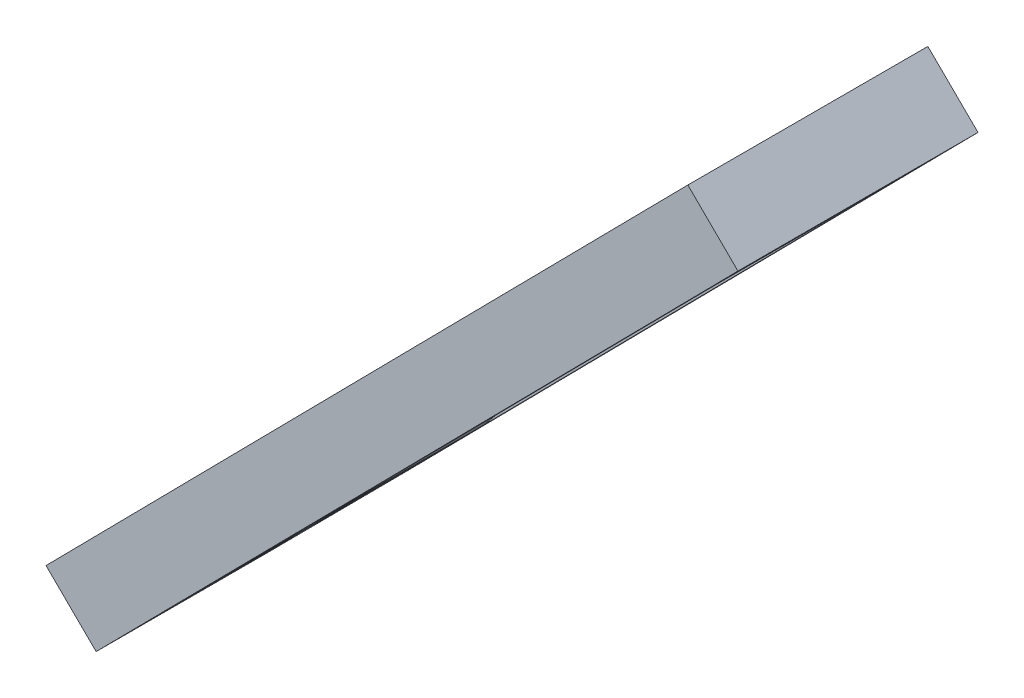
ISO-10303-21;
HEADER;
FILE_DESCRIPTION(('STEP AP214'),'2;1');
FILE_NAME('part.step','',(''),(''),'','','');
FILE_SCHEMA(('AUTOMOTIVE_DESIGN { 1 0 10303 214 1 1 1 1 }'));
ENDSEC;
DATA;
#1=APPLICATION_CONTEXT('core data for automotive mechanical design processes');
#2=APPLICATION_PROTOCOL_DEFINITION('international standard','automotive_design',2000,#1);
#3=PRODUCT_CONTEXT('',#1,'mechanical');
#4=PRODUCT('Part','Part','',(#3));
#5=PRODUCT_RELATED_PRODUCT_CATEGORY('part','',(#4));
#6=PRODUCT_DEFINITION_FORMATION('','',#4);
#7=PRODUCT_DEFINITION_CONTEXT('part definition',#1,'design');
#8=PRODUCT_DEFINITION('design','',#6,#7);
#9=PRODUCT_DEFINITION_SHAPE('','',#8);
#10=(LENGTH_UNIT() NAMED_UNIT(*) SI_UNIT(.MILLI.,.METRE.));
#11=(NAMED_UNIT(*) PLANE_ANGLE_UNIT() SI_UNIT($,.RADIAN.));
#12=(NAMED_UNIT(*) SI_UNIT($,.STERADIAN.) SOLID_ANGLE_UNIT());
#13=UNCERTAINTY_MEASURE_WITH_UNIT(LENGTH_MEASURE(1.E-05),#10,'distance_accuracy_value','');
#14=(GEOMETRIC_REPRESENTATION_CONTEXT(3) GLOBAL_UNCERTAINTY_ASSIGNED_CONTEXT((#13)) GLOBAL_UNIT_ASSIGNED_CONTEXT((#10,
#11,#12)) REPRESENTATION_CONTEXT('',''));
#15=CARTESIAN_POINT('',(0.,0.,0.));
#16=DIRECTION('',(0.,0.,1.));
#17=DIRECTION('',(1.,0.,0.));
#18=AXIS2_PLACEMENT_3D('',#15,#16,#17);
#19=CARTESIAN_POINT('',(-24.6035409540057,49.3721859191948,92.15));
#20=DIRECTION('',(0.702343730166743,0.711837962387133,0.));
#21=DIRECTION('',(0.711837962387133,-0.702343730166743,0.));
#22=AXIS2_PLACEMENT_3D('',#19,#20,#21);
#23=PLANE('',#22);
#24=DIRECTION('',(0.711837962387133,-0.702343730166743,0.));
#25=VECTOR('',#24,1.);
#26=CARTESIAN_POINT('',(-25.8136654900639,50.5661702604782,95.45));
#27=LINE('',#26,#25);
#28=CARTESIAN_POINT('',(-25.8136654900639,50.5661702604782,95.45));
#29=VERTEX_POINT('',#28);
#30=CARTESIAN_POINT('',(-24.6035409540057,49.3721859191948,95.45));
#31=VERTEX_POINT('',#30);
#32=EDGE_CURVE('E223',#29,#31,#27,.T.);
#33=ORIENTED_EDGE('',*,*,#32,.T.);
#34=DIRECTION('',(0.,0.,1.));
#35=VECTOR('',#34,1.);
#36=CARTESIAN_POINT('',(-24.6035409540057,49.3721859191948,92.15));
#37=LINE('',#36,#35);
#38=CARTESIAN_POINT('',(-24.6035409540057,49.3721859191948,97.65));
#39=VERTEX_POINT('',#38);
#40=EDGE_CURVE('E240',#31,#39,#37,.T.);
#41=ORIENTED_EDGE('',*,*,#40,.T.);
#42=DIRECTION('',(0.711837962387133,-0.702343730166743,0.));
#43=VECTOR('',#42,1.);
#44=CARTESIAN_POINT('',(-24.6035409540057,49.3721859191948,97.65));
#45=LINE('',#44,#43);
#46=CARTESIAN_POINT('',(-25.8136654900639,50.5661702604782,97.65));
#47=VERTEX_POINT('',#46);
#48=EDGE_CURVE('E377',#47,#39,#45,.T.);
#49=ORIENTED_EDGE('',*,*,#48,.F.);
#50=DIRECTION('',(0.,0.,1.));
#51=VECTOR('',#50,1.);
#52=CARTESIAN_POINT('',(-25.8136654900639,50.5661702604782,92.15));
#53=LINE('',#52,#51);
#54=EDGE_CURVE('E252',#29,#47,#53,.T.);
#55=ORIENTED_EDGE('',*,*,#54,.F.);
#56=EDGE_LOOP('',(#33,#41,#49,#55));
#57=FACE_BOUND('',#56,.T.);
#58=ADVANCED_FACE('F36',(#57),#23,.F.);
#59=CARTESIAN_POINT('',(-25.8136654900639,50.5661702604782,92.15));
#60=DIRECTION('',(-0.774517720209106,0.632552212139116,0.));
#61=DIRECTION('',(0.632552212139116,0.774517720209106,0.));
#62=AXIS2_PLACEMENT_3D('',#59,#60,#61);
#63=PLANE('',#62);
#64=DIRECTION('',(0.632552212139115,0.774517720209107,0.));
#65=VECTOR('',#64,1.);
#66=CARTESIAN_POINT('',(-28.4507583892312,47.33722703485,95.45));
#67=LINE('',#66,#65);
#68=CARTESIAN_POINT('',(-28.4507583892312,47.33722703485,95.45));
#69=VERTEX_POINT('',#68);
#70=EDGE_CURVE('E224',#69,#29,#67,.T.);
#71=ORIENTED_EDGE('',*,*,#70,.T.);
#72=ORIENTED_EDGE('',*,*,#54,.T.);
#73=DIRECTION('',(0.632552212139116,0.774517720209106,0.));
#74=VECTOR('',#73,1.);
#75=CARTESIAN_POINT('',(-25.8136654900639,50.5661702604782,97.65));
#76=LINE('',#75,#74);
#77=CARTESIAN_POINT('',(-37.2897005260863,36.5145357510014,97.65));
#78=VERTEX_POINT('',#77);
#79=EDGE_CURVE('E384',#78,#47,#76,.T.);
#80=ORIENTED_EDGE('',*,*,#79,.F.);
#81=DIRECTION('',(0.,0.,1.));
#82=VECTOR('',#81,1.);
#83=CARTESIAN_POINT('',(-37.2897005260863,36.5145357510014,92.15));
#84=LINE('',#83,#82);
#85=CARTESIAN_POINT('',(-37.2897005260863,36.5145357510014,92.15));
#86=VERTEX_POINT('',#85);
#87=EDGE_CURVE('E382',#86,#78,#84,.T.);
#88=ORIENTED_EDGE('',*,*,#87,.F.);
#89=DIRECTION('',(0.632552212139116,0.774517720209106,0.));
#90=VECTOR('',#89,1.);
#91=CARTESIAN_POINT('',(-25.8136654900639,50.5661702604782,92.15));
#92=LINE('',#91,#90);
#93=CARTESIAN_POINT('',(-25.8136654900639,50.5661702604782,92.15));
#94=VERTEX_POINT('',#93);
#95=EDGE_CURVE('E376',#86,#94,#92,.T.);
#96=ORIENTED_EDGE('',*,*,#95,.T.);
#97=CARTESIAN_POINT('',(-25.8136654900639,50.5661702604782,94.45));
#98=VERTEX_POINT('',#97);
#99=EDGE_CURVE('E248',#94,#98,#53,.T.);
#100=ORIENTED_EDGE('',*,*,#99,.T.);
#101=DIRECTION('',(0.632552212139115,0.774517720209107,0.));
#102=VECTOR('',#101,1.);
#103=CARTESIAN_POINT('',(-28.4507583892312,47.33722703485,94.45));
#104=LINE('',#103,#102);
#105=CARTESIAN_POINT('',(-28.4507583892312,47.33722703485,94.45));
#106=VERTEX_POINT('',#105);
#107=EDGE_CURVE('E253',#106,#98,#104,.T.);
#108=ORIENTED_EDGE('',*,*,#107,.F.);
#109=DIRECTION('',(0.,0.,-1.));
#110=VECTOR('',#109,1.);
#111=CARTESIAN_POINT('',(-28.4507583892312,47.33722703485,95.45));
#112=LINE('',#111,#110);
#113=EDGE_CURVE('E237',#69,#106,#112,.T.);
#114=ORIENTED_EDGE('',*,*,#113,.F.);
#115=EDGE_LOOP('',(#71,#72,#80,#88,#96,#100,#108,#114));
#116=FACE_BOUND('',#115,.T.);
#117=ADVANCED_FACE('F456',(#116),#63,.F.);
#118=CARTESIAN_POINT('',(-37.1508087961253,36.6553050094161,0.));
#119=DIRECTION('',(0.71183796238714,-0.702343730166737,0.));
#120=DIRECTION('',(-0.702343730166737,-0.71183796238714,0.));
#121=AXIS2_PLACEMENT_3D('',#118,#119,#120);
#122=PLANE('',#121);
#123=CARTESIAN_POINT('',(-41.9655545474581,31.7754738700007,93.0729681256926));
#124=DIRECTION('',(-0.71183796238714,0.702343730166736,0.));
#125=DIRECTION('',(-0.702343730166737,-0.71183796238714,0.));
#126=AXIS2_PLACEMENT_3D('',#123,#124,#125);
#127=CIRCLE('',#126,0.321376144753736);
#128=CARTESIAN_POINT('',(-41.8376796329103,31.9050773884808,92.8081407089779));
#129=VERTEX_POINT('',#128);
#130=CARTESIAN_POINT('',(-42.0934294620058,31.6458703515205,93.3377955424072));
#131=VERTEX_POINT('',#130);
#132=EDGE_CURVE('E270',#129,#131,#127,.T.);
#133=ORIENTED_EDGE('',*,*,#132,.T.);
#134=DIRECTION('',(0.578760678855961,0.58658432424366,0.566528822887059));
#135=VECTOR('',#134,1.);
#136=CARTESIAN_POINT('',(-42.0934294620058,31.6458703515205,93.3377955424072));
#137=LINE('',#136,#135);
#138=CARTESIAN_POINT('',(-41.0297885386712,32.7238894966453,94.3789568760734));
#139=VERTEX_POINT('',#138);
#140=EDGE_CURVE('E273',#131,#139,#137,.T.);
#141=ORIENTED_EDGE('',*,*,#140,.T.);
#142=CARTESIAN_POINT('',(-40.9019136241235,32.8534930151254,94.1141294593588));
#143=DIRECTION('',(-0.71183796238714,0.702343730166736,0.));
#144=DIRECTION('',(-0.702343730166737,-0.71183796238714,0.));
#145=AXIS2_PLACEMENT_3D('',#142,#143,#144);
#146=CIRCLE('',#145,0.321376144753728);
#147=CARTESIAN_POINT('',(-40.7740387095758,32.9830965336056,93.8493020426442));
#148=VERTEX_POINT('',#147);
#149=EDGE_CURVE('E277',#139,#148,#146,.T.);
#150=ORIENTED_EDGE('',*,*,#149,.T.);
#151=DIRECTION('',(-0.578760678855957,-0.586584324243656,-0.566528822887067));
#152=VECTOR('',#151,1.);
#153=CARTESIAN_POINT('',(-41.8376796329103,31.9050773884808,92.8081407089779));
#154=LINE('',#153,#152);
#155=EDGE_CURVE('E264',#148,#129,#154,.T.);
#156=ORIENTED_EDGE('',*,*,#155,.T.);
#157=EDGE_LOOP('',(#133,#141,#150,#156));
#158=FACE_BOUND('',#157,.T.);
#159=CARTESIAN_POINT('',(-40.9019136241235,32.8534930151254,96.328756093485));
#160=DIRECTION('',(-0.71183796238714,0.702343730166736,0.));
#161=DIRECTION('',(-0.702343730166737,-0.71183796238714,0.));
#162=AXIS2_PLACEMENT_3D('',#159,#160,#161);
#163=CIRCLE('',#162,0.305790106119295);
#164=CARTESIAN_POINT('',(-40.7664813949906,32.9907560074278,96.5660840759412));
#165=VERTEX_POINT('',#164);
#166=CARTESIAN_POINT('',(-41.0373458532563,32.7162300228231,96.0914281110288));
#167=VERTEX_POINT('',#166);
#168=EDGE_CURVE('E300',#165,#167,#163,.T.);
#169=ORIENTED_EDGE('',*,*,#168,.T.);
#170=DIRECTION('',(-0.545098801876283,-0.552467408422892,0.630592625094469));
#171=VECTOR('',#170,1.);
#172=CARTESIAN_POINT('',(-41.0373458532564,32.716230022823,96.0914281110288));
#173=LINE('',#172,#171);
#174=CARTESIAN_POINT('',(-42.1009867765909,31.6382108776983,97.3218915053616));
#175=VERTEX_POINT('',#174);
#176=EDGE_CURVE('E303',#167,#175,#173,.T.);
#177=ORIENTED_EDGE('',*,*,#176,.T.);
#178=CARTESIAN_POINT('',(-41.9655545474581,31.7754738700007,97.5592194878178));
#179=DIRECTION('',(-0.71183796238714,0.702343730166736,0.));
#180=DIRECTION('',(-0.702343730166737,-0.71183796238714,0.));
#181=AXIS2_PLACEMENT_3D('',#178,#179,#180);
#182=CIRCLE('',#181,0.305790106119294);
#183=CARTESIAN_POINT('',(-41.8301223183252,31.9127368623031,97.7965474702741));
#184=VERTEX_POINT('',#183);
#185=EDGE_CURVE('E307',#175,#184,#182,.T.);
#186=ORIENTED_EDGE('',*,*,#185,.T.);
#187=DIRECTION('',(0.545098801876282,0.552467408422894,-0.630592625094468));
#188=VECTOR('',#187,1.);
#189=CARTESIAN_POINT('',(-40.7664813949906,32.9907560074278,96.5660840759412));
#190=LINE('',#189,#188);
#191=EDGE_CURVE('E293',#184,#165,#190,.T.);
#192=ORIENTED_EDGE('',*,*,#191,.T.);
#193=EDGE_LOOP('',(#169,#177,#186,#192));
#194=FACE_BOUND('',#193,.T.);
#195=CARTESIAN_POINT('',(-38.0875354506696,35.7059157510736,93.0729681256926));
#196=DIRECTION('',(-0.71183796238714,0.702343730166736,0.));
#197=DIRECTION('',(-0.702343730166737,-0.71183796238714,0.));
#198=AXIS2_PLACEMENT_3D('',#195,#196,#197);
#199=CIRCLE('',#198,0.332328622406024);
#200=CARTESIAN_POINT('',(-37.9403495043736,35.8550913464455,93.3308930221812));
#201=VERTEX_POINT('',#200);
#202=CARTESIAN_POINT('',(-38.2347213969655,35.5567401557017,92.8150432292039));
#203=VERTEX_POINT('',#202);
#204=EDGE_CURVE('E329',#201,#203,#199,.T.);
#205=ORIENTED_EDGE('',*,*,#204,.T.);
#206=DIRECTION('',(-0.545098801876284,-0.552467408422895,0.630592625094466));
#207=VECTOR('',#206,1.);
#208=CARTESIAN_POINT('',(-38.2347213969655,35.5567401557018,92.8150432292039));
#209=LINE('',#208,#207);
#210=CARTESIAN_POINT('',(-39.1347252551717,34.644570109827,93.8562045628701));
#211=VERTEX_POINT('',#210);
#212=EDGE_CURVE('E332',#203,#211,#209,.T.);
#213=ORIENTED_EDGE('',*,*,#212,.T.);
#214=CARTESIAN_POINT('',(-38.9875393088757,34.7937457051989,94.1141294593588));
#215=DIRECTION('',(-0.71183796238714,0.702343730166736,0.));
#216=DIRECTION('',(-0.702343730166737,-0.71183796238714,0.));
#217=AXIS2_PLACEMENT_3D('',#214,#215,#216);
#218=CIRCLE('',#217,0.332328622406024);
#219=CARTESIAN_POINT('',(-38.8403533625798,34.9429213005708,94.3720543558475));
#220=VERTEX_POINT('',#219);
#221=EDGE_CURVE('E336',#211,#220,#218,.T.);
#222=ORIENTED_EDGE('',*,*,#221,.T.);
#223=DIRECTION('',(0.545098801876284,0.552467408422895,-0.630592625094466));
#224=VECTOR('',#223,1.);
#225=CARTESIAN_POINT('',(-37.9403495043736,35.8550913464455,93.3308930221812));
#226=LINE('',#225,#224);
#227=EDGE_CURVE('E322',#220,#201,#226,.T.);
#228=ORIENTED_EDGE('',*,*,#227,.T.);
#229=EDGE_LOOP('',(#205,#213,#222,#228));
#230=FACE_BOUND('',#229,.T.);
#231=CARTESIAN_POINT('',(-38.9875393088757,34.7937457051989,95.9880443036195));
#232=DIRECTION('',(-0.71183796238714,0.702343730166736,0.));
#233=DIRECTION('',(-0.702343730166737,-0.71183796238714,0.));
#234=AXIS2_PLACEMENT_3D('',#231,#232,#233);
#235=CIRCLE('',#234,0.327637782178827);
#236=CARTESIAN_POINT('',(-38.8571729015282,34.9258743962999,95.7180570351524));
#237=VERTEX_POINT('',#236);
#238=CARTESIAN_POINT('',(-39.1179057162232,34.6616170140979,96.2580315720865));
#239=VERTEX_POINT('',#238);
#240=EDGE_CURVE('E236',#237,#239,#235,.T.);
#241=ORIENTED_EDGE('',*,*,#240,.T.);
#242=DIRECTION('',(0.578760678855961,0.586584324243655,0.566528822887064));
#243=VECTOR('',#242,1.);
#244=CARTESIAN_POINT('',(-39.1179057162232,34.6616170140979,96.2580315720865));
#245=LINE('',#244,#243);
#246=CARTESIAN_POINT('',(-38.217901858017,35.5737870599726,97.1390142390349));
#247=VERTEX_POINT('',#246);
#248=EDGE_CURVE('E360',#239,#247,#245,.T.);
#249=ORIENTED_EDGE('',*,*,#248,.T.);
#250=CARTESIAN_POINT('',(-38.0875354506696,35.7059157510736,96.8690269705678));
#251=DIRECTION('',(-0.71183796238714,0.702343730166736,0.));
#252=DIRECTION('',(-0.702343730166737,-0.71183796238714,0.));
#253=AXIS2_PLACEMENT_3D('',#250,#251,#252);
#254=CIRCLE('',#253,0.327637782178827);
#255=CARTESIAN_POINT('',(-37.9571690433221,35.8380444421747,96.5990397021008));
#256=VERTEX_POINT('',#255);
#257=EDGE_CURVE('E363',#247,#256,#254,.T.);
#258=ORIENTED_EDGE('',*,*,#257,.T.);
#259=DIRECTION('',(-0.578760678855961,-0.586584324243655,-0.566528822887064));
#260=VECTOR('',#259,1.);
#261=CARTESIAN_POINT('',(-38.8571729015282,34.9258743962999,95.7180570351524));
#262=LINE('',#261,#260);
#263=EDGE_CURVE('E351',#256,#237,#262,.T.);
#264=ORIENTED_EDGE('',*,*,#263,.T.);
#265=EDGE_LOOP('',(#241,#249,#258,#264));
#266=FACE_BOUND('',#265,.T.);
#267=DIRECTION('',(-0.58969934349156,-0.597670856964029,0.543179740989579));
#268=VECTOR('',#267,1.);
#269=CARTESIAN_POINT('',(-8.97574379923739,65.2112385161459,62.0086944342022));
#270=LINE('',#269,#268);
#271=CARTESIAN_POINT('',(-40.6128014135928,33.1465134238028,91.15));
#272=VERTEX_POINT('',#271);
#273=CARTESIAN_POINT('',(-42.9084503674201,30.8198320519043,93.2645521322101));
#274=VERTEX_POINT('',#273);
#275=EDGE_CURVE('E391',#272,#274,#270,.T.);
#276=ORIENTED_EDGE('',*,*,#275,.F.);
#277=DIRECTION('',(-0.702343730166737,-0.71183796238714,0.));
#278=VECTOR('',#277,1.);
#279=CARTESIAN_POINT('',(-37.1508087961253,36.6553050094161,91.15));
#280=LINE('',#279,#278);
#281=CARTESIAN_POINT('',(-22.8559679123544,51.1433825280069,91.15));
#282=VERTEX_POINT('',#281);
#283=EDGE_CURVE('E404',#282,#272,#280,.T.);
#284=ORIENTED_EDGE('',*,*,#283,.F.);
#285=DIRECTION('',(0.,0.,-1.));
#286=VECTOR('',#285,1.);
#287=CARTESIAN_POINT('',(-22.8559679123544,51.1433825280069,0.));
#288=LINE('',#287,#286);
#289=CARTESIAN_POINT('',(-22.8559679123544,51.1433825280069,98.65));
#290=VERTEX_POINT('',#289);
#291=EDGE_CURVE('E401',#290,#282,#288,.T.);
#292=ORIENTED_EDGE('',*,*,#291,.F.);
#293=DIRECTION('',(0.702343730166737,0.71183796238714,0.));
#294=VECTOR('',#293,1.);
#295=CARTESIAN_POINT('',(-37.1508087961253,36.6553050094161,98.65));
#296=LINE('',#295,#294);
#297=CARTESIAN_POINT('',(-42.9084503674201,30.8198320519043,98.65));
#298=VERTEX_POINT('',#297);
#299=EDGE_CURVE('E398',#298,#290,#296,.T.);
#300=ORIENTED_EDGE('',*,*,#299,.F.);
#301=DIRECTION('',(0.,0.,1.));
#302=VECTOR('',#301,1.);
#303=CARTESIAN_POINT('',(-42.9084503674201,30.8198320519043,0.));
#304=LINE('',#303,#302);
#305=EDGE_CURVE('E394',#274,#298,#304,.T.);
#306=ORIENTED_EDGE('',*,*,#305,.F.);
#307=EDGE_LOOP('',(#276,#284,#292,#300,#306));
#308=FACE_BOUND('',#307,.T.);
#309=ORIENTED_EDGE('',*,*,#87,.T.);
#310=DIRECTION('',(-0.702343730166737,-0.711837962387139,0.));
#311=VECTOR('',#310,1.);
#312=CARTESIAN_POINT('',(-24.6035409540057,49.3721859191948,97.65));
#313=LINE('',#312,#311);
#314=EDGE_CURVE('E243',#39,#78,#313,.T.);
#315=ORIENTED_EDGE('',*,*,#314,.F.);
#316=ORIENTED_EDGE('',*,*,#40,.F.);
#317=DIRECTION('',(0.,0.,-1.));
#318=VECTOR('',#317,1.);
#319=CARTESIAN_POINT('',(-24.6035409540057,49.3721859191948,95.45));
#320=LINE('',#319,#318);
#321=CARTESIAN_POINT('',(-24.6035409540057,49.3721859191948,94.45));
#322=VERTEX_POINT('',#321);
#323=EDGE_CURVE('E230',#31,#322,#320,.T.);
#324=ORIENTED_EDGE('',*,*,#323,.T.);
#325=CARTESIAN_POINT('',(-24.6035409540057,49.3721859191948,92.15));
#326=VERTEX_POINT('',#325);
#327=EDGE_CURVE('E247',#326,#322,#37,.T.);
#328=ORIENTED_EDGE('',*,*,#327,.F.);
#329=DIRECTION('',(-0.702343730166737,-0.711837962387139,0.));
#330=VECTOR('',#329,1.);
#331=CARTESIAN_POINT('',(-24.6035409540057,49.3721859191948,92.15));
#332=LINE('',#331,#330);
#333=EDGE_CURVE('E374',#326,#86,#332,.T.);
#334=ORIENTED_EDGE('',*,*,#333,.T.);
#335=EDGE_LOOP('',(#309,#315,#316,#324,#328,#334));
#336=FACE_BOUND('',#335,.T.);
#337=ADVANCED_FACE('F242',(#158,#194,#230,#266,#308,#336),#122,.T.);
#338=CARTESIAN_POINT('',(-8.97574379923739,65.2112385161459,62.0086944342022));
#339=DIRECTION('',(0.381498885437623,0.386655960035996,0.839616441584188));
#340=DIRECTION('',(-0.908230897921145,-0.012195524483952,0.418291650937373));
#341=AXIS2_PLACEMENT_3D('',#338,#339,#340);
#342=PLANE('',#341);
#343=DIRECTION('',(-0.58969934349156,-0.597670856964029,0.543179740989579));
#344=VECTOR('',#343,1.);
#345=CARTESIAN_POINT('',(-10.5417873164891,66.7563947225128,62.0086944342022));
#346=LINE('',#345,#344);
#347=CARTESIAN_POINT('',(-42.1788449308445,34.6916696301696,91.15));
#348=VERTEX_POINT('',#347);
#349=CARTESIAN_POINT('',(-44.4744938846718,32.3649882582711,93.2645521322101));
#350=VERTEX_POINT('',#349);
#351=EDGE_CURVE('E387',#348,#350,#346,.T.);
#352=ORIENTED_EDGE('',*,*,#351,.F.);
#353=DIRECTION('',(-0.71183796238714,0.702343730166737,0.));
#354=VECTOR('',#353,1.);
#355=CARTESIAN_POINT('',(-40.6128014135928,33.1465134238028,91.15));
#356=LINE('',#355,#354);
#357=EDGE_CURVE('E407',#272,#348,#356,.T.);
#358=ORIENTED_EDGE('',*,*,#357,.F.);
#359=ORIENTED_EDGE('',*,*,#275,.T.);
#360=DIRECTION('',(-0.71183796238714,0.702343730166737,0.));
#361=VECTOR('',#360,1.);
#362=CARTESIAN_POINT('',(-42.9084503674201,30.8198320519043,93.2645521322101));
#363=LINE('',#362,#361);
#364=EDGE_CURVE('E11',#274,#350,#363,.T.);
#365=ORIENTED_EDGE('',*,*,#364,.T.);
#366=EDGE_LOOP('',(#352,#358,#359,#365));
#367=FACE_BOUND('',#366,.T.);
#368=ADVANCED_FACE('F38',(#367),#342,.F.);
#369=CARTESIAN_POINT('',(-42.9084503674201,30.8198320519043,0.));
#370=DIRECTION('',(0.702343730166737,0.71183796238714,0.));
#371=DIRECTION('',(0.71183796238714,-0.702343730166737,0.));
#372=AXIS2_PLACEMENT_3D('',#369,#370,#371);
#373=PLANE('',#372);
#374=DIRECTION('',(0.,0.,1.));
#375=VECTOR('',#374,1.);
#376=CARTESIAN_POINT('',(-44.4744938846719,32.3649882582711,0.));
#377=LINE('',#376,#375);
#378=CARTESIAN_POINT('',(-44.4744938846718,32.3649882582711,98.65));
#379=VERTEX_POINT('',#378);
#380=EDGE_CURVE('E410',#350,#379,#377,.T.);
#381=ORIENTED_EDGE('',*,*,#380,.F.);
#382=ORIENTED_EDGE('',*,*,#364,.F.);
#383=ORIENTED_EDGE('',*,*,#305,.T.);
#384=DIRECTION('',(-0.71183796238714,0.702343730166737,0.));
#385=VECTOR('',#384,1.);
#386=CARTESIAN_POINT('',(-42.9084503674201,30.8198320519043,98.65));
#387=LINE('',#386,#385);
#388=EDGE_CURVE('E44',#298,#379,#387,.T.);
#389=ORIENTED_EDGE('',*,*,#388,.T.);
#390=EDGE_LOOP('',(#381,#382,#383,#389));
#391=FACE_BOUND('',#390,.T.);
#392=ADVANCED_FACE('F429',(#391),#373,.F.);
#393=CARTESIAN_POINT('',(-37.1508087961253,36.6553050094161,98.65));
#394=DIRECTION('',(0.,0.,-1.));
#395=DIRECTION('',(0.0134265693909492,-0.999909859554545,0.));
#396=AXIS2_PLACEMENT_3D('',#393,#394,#395);
#397=PLANE('',#396);
#398=DIRECTION('',(0.702343730166737,0.71183796238714,0.));
#399=VECTOR('',#398,1.);
#400=CARTESIAN_POINT('',(-38.716852313377,38.2004612157829,98.65));
#401=LINE('',#400,#399);
#402=CARTESIAN_POINT('',(-24.4220114296061,52.6885387343737,98.65));
#403=VERTEX_POINT('',#402);
#404=EDGE_CURVE('E413',#379,#403,#401,.T.);
#405=ORIENTED_EDGE('',*,*,#404,.F.);
#406=ORIENTED_EDGE('',*,*,#388,.F.);
#407=ORIENTED_EDGE('',*,*,#299,.T.);
#408=DIRECTION('',(-0.71183796238714,0.702343730166737,0.));
#409=VECTOR('',#408,1.);
#410=CARTESIAN_POINT('',(-22.8559679123544,51.1433825280069,98.65));
#411=LINE('',#410,#409);
#412=EDGE_CURVE('E425',#290,#403,#411,.T.);
#413=ORIENTED_EDGE('',*,*,#412,.T.);
#414=EDGE_LOOP('',(#405,#406,#407,#413));
#415=FACE_BOUND('',#414,.T.);
#416=ADVANCED_FACE('F441',(#415),#397,.F.);
#417=CARTESIAN_POINT('',(-22.8559679123544,51.1433825280069,0.));
#418=DIRECTION('',(-0.702343730166737,-0.71183796238714,0.));
#419=DIRECTION('',(-0.71183796238714,0.702343730166737,0.));
#420=AXIS2_PLACEMENT_3D('',#417,#418,#419);
#421=PLANE('',#420);
#422=DIRECTION('',(0.,0.,-1.));
#423=VECTOR('',#422,1.);
#424=CARTESIAN_POINT('',(-24.4220114296061,52.6885387343737,0.));
#425=LINE('',#424,#423);
#426=CARTESIAN_POINT('',(-24.4220114296061,52.6885387343737,91.15));
#427=VERTEX_POINT('',#426);
#428=EDGE_CURVE('E416',#403,#427,#425,.T.);
#429=ORIENTED_EDGE('',*,*,#428,.F.);
#430=ORIENTED_EDGE('',*,*,#412,.F.);
#431=ORIENTED_EDGE('',*,*,#291,.T.);
#432=DIRECTION('',(-0.71183796238714,0.702343730166737,0.));
#433=VECTOR('',#432,1.);
#434=CARTESIAN_POINT('',(-22.8559679123544,51.1433825280069,91.15));
#435=LINE('',#434,#433);
#436=EDGE_CURVE('E422',#282,#427,#435,.T.);
#437=ORIENTED_EDGE('',*,*,#436,.T.);
#438=EDGE_LOOP('',(#429,#430,#431,#437));
#439=FACE_BOUND('',#438,.T.);
#440=ADVANCED_FACE('F443',(#439),#421,.F.);
#441=CARTESIAN_POINT('',(-37.1508087961253,36.6553050094161,91.15));
#442=DIRECTION('',(0.,0.,1.));
#443=DIRECTION('',(-0.0134265693909492,0.999909859554545,0.));
#444=AXIS2_PLACEMENT_3D('',#441,#442,#443);
#445=PLANE('',#444);
#446=DIRECTION('',(-0.702343730166737,-0.71183796238714,0.));
#447=VECTOR('',#446,1.);
#448=CARTESIAN_POINT('',(-38.716852313377,38.2004612157829,91.15));
#449=LINE('',#448,#447);
#450=EDGE_CURVE('E395',#427,#348,#449,.T.);
#451=ORIENTED_EDGE('',*,*,#450,.F.);
#452=ORIENTED_EDGE('',*,*,#436,.F.);
#453=ORIENTED_EDGE('',*,*,#283,.T.);
#454=ORIENTED_EDGE('',*,*,#357,.T.);
#455=EDGE_LOOP('',(#451,#452,#453,#454));
#456=FACE_BOUND('',#455,.T.);
#457=ADVANCED_FACE('F445',(#456),#445,.F.);
#458=CARTESIAN_POINT('',(-38.7168523133771,38.2004612157829,0.));
#459=DIRECTION('',(0.71183796238714,-0.702343730166737,0.));
#460=DIRECTION('',(-0.702343730166737,-0.71183796238714,0.));
#461=AXIS2_PLACEMENT_3D('',#458,#459,#460);
#462=PLANE('',#461);
#463=ORIENTED_EDGE('',*,*,#351,.T.);
#464=ORIENTED_EDGE('',*,*,#380,.T.);
#465=ORIENTED_EDGE('',*,*,#404,.T.);
#466=ORIENTED_EDGE('',*,*,#428,.T.);
#467=ORIENTED_EDGE('',*,*,#450,.T.);
#468=EDGE_LOOP('',(#463,#464,#465,#466,#467));
#469=FACE_BOUND('',#468,.T.);
#470=ADVANCED_FACE('F434',(#469),#462,.F.);
#471=ORIENTED_EDGE('',*,*,#99,.F.);
#472=DIRECTION('',(0.711837962387133,-0.702343730166743,0.));
#473=VECTOR('',#472,1.);
#474=CARTESIAN_POINT('',(-24.6035409540057,49.3721859191948,92.15));
#475=LINE('',#474,#473);
#476=EDGE_CURVE('E380',#94,#326,#475,.T.);
#477=ORIENTED_EDGE('',*,*,#476,.T.);
#478=ORIENTED_EDGE('',*,*,#327,.T.);
#479=DIRECTION('',(0.711837962387133,-0.702343730166743,0.));
#480=VECTOR('',#479,1.);
#481=CARTESIAN_POINT('',(-25.8136654900639,50.5661702604782,94.45));
#482=LINE('',#481,#480);
#483=EDGE_CURVE('E51',#98,#322,#482,.T.);
#484=ORIENTED_EDGE('',*,*,#483,.F.);
#485=EDGE_LOOP('',(#471,#477,#478,#484));
#486=FACE_BOUND('',#485,.T.);
#487=ADVANCED_FACE('F452',(#486),#23,.F.);
#488=CARTESIAN_POINT('',(-91.6704638744969,90.4477970349006,92.15));
#489=DIRECTION('',(0.,0.,1.));
#490=DIRECTION('',(-0.0134265693909492,0.999909859554545,0.));
#491=AXIS2_PLACEMENT_3D('',#488,#489,#490);
#492=PLANE('',#491);
#493=ORIENTED_EDGE('',*,*,#333,.F.);
#494=ORIENTED_EDGE('',*,*,#476,.F.);
#495=ORIENTED_EDGE('',*,*,#95,.F.);
#496=EDGE_LOOP('',(#493,#494,#495));
#497=FACE_BOUND('',#496,.T.);
#498=ADVANCED_FACE('F465',(#497),#492,.T.);
#499=CARTESIAN_POINT('',(-91.6704638744969,90.4477970349006,97.65));
#500=DIRECTION('',(0.,0.,1.));
#501=DIRECTION('',(-0.0134265693909492,0.999909859554545,0.));
#502=AXIS2_PLACEMENT_3D('',#499,#500,#501);
#503=PLANE('',#502);
#504=ORIENTED_EDGE('',*,*,#314,.T.);
#505=ORIENTED_EDGE('',*,*,#79,.T.);
#506=ORIENTED_EDGE('',*,*,#48,.T.);
#507=EDGE_LOOP('',(#504,#505,#506));
#508=FACE_BOUND('',#507,.T.);
#509=ADVANCED_FACE('F469',(#508),#503,.F.);
#510=CARTESIAN_POINT('',(-39.6993772712629,35.4960894353656,95.9880443036195));
#511=DIRECTION('',(0.71183796238714,-0.702343730166736,0.));
#512=DIRECTION('',(-0.702343730166737,-0.71183796238714,0.));
#513=AXIS2_PLACEMENT_3D('',#510,#511,#512);
#514=CYLINDRICAL_SURFACE('',#513,0.327637782178827);
#515=ORIENTED_EDGE('',*,*,#240,.F.);
#516=DIRECTION('',(0.71183796238714,-0.702343730166736,0.));
#517=VECTOR('',#516,1.);
#518=CARTESIAN_POINT('',(-39.5690108639154,35.6282181264667,95.7180570351524));
#519=LINE('',#518,#517);
#520=CARTESIAN_POINT('',(-39.5690108639154,35.6282181264667,95.7180570351524));
#521=VERTEX_POINT('',#520);
#522=EDGE_CURVE('E333',#521,#237,#519,.T.);
#523=ORIENTED_EDGE('',*,*,#522,.F.);
#524=CARTESIAN_POINT('',(-39.6993772712629,35.4960894353656,95.9880443036195));
#525=DIRECTION('',(-0.71183796238714,0.702343730166736,0.));
#526=DIRECTION('',(-0.702343730166737,-0.71183796238714,0.));
#527=AXIS2_PLACEMENT_3D('',#524,#525,#526);
#528=CIRCLE('',#527,0.327637782178827);
#529=CARTESIAN_POINT('',(-39.8297436786103,35.3639607442646,96.2580315720865));
#530=VERTEX_POINT('',#529);
#531=EDGE_CURVE('E347',#521,#530,#528,.T.);
#532=ORIENTED_EDGE('',*,*,#531,.T.);
#533=DIRECTION('',(0.71183796238714,-0.702343730166736,0.));
#534=VECTOR('',#533,1.);
#535=CARTESIAN_POINT('',(-39.8297436786103,35.3639607442646,96.2580315720865));
#536=LINE('',#535,#534);
#537=EDGE_CURVE('E357',#530,#239,#536,.T.);
#538=ORIENTED_EDGE('',*,*,#537,.T.);
#539=EDGE_LOOP('',(#515,#523,#532,#538));
#540=FACE_BOUND('',#539,.T.);
#541=ADVANCED_FACE('F479',(#540),#514,.F.);
#542=CARTESIAN_POINT('',(-39.5690108639154,35.6282181264667,95.7180570351524));
#543=DIRECTION('',(0.397897966713471,0.403276722917512,-0.824041924199369));
#544=DIRECTION('',(0.898126218699871,0.0120598410766515,0.439572355269388));
#545=AXIS2_PLACEMENT_3D('',#542,#543,#544);
#546=PLANE('',#545);
#547=ORIENTED_EDGE('',*,*,#263,.F.);
#548=DIRECTION('',(0.71183796238714,-0.702343730166736,0.));
#549=VECTOR('',#548,1.);
#550=CARTESIAN_POINT('',(-38.6690070057092,36.5403881723414,96.5990397021008));
#551=LINE('',#550,#549);
#552=CARTESIAN_POINT('',(-38.6690070057092,36.5403881723414,96.5990397021008));
#553=VERTEX_POINT('',#552);
#554=EDGE_CURVE('E369',#553,#256,#551,.T.);
#555=ORIENTED_EDGE('',*,*,#554,.F.);
#556=DIRECTION('',(-0.578760678855961,-0.586584324243655,-0.566528822887064));
#557=VECTOR('',#556,1.);
#558=CARTESIAN_POINT('',(-39.5690108639154,35.6282181264667,95.7180570351524));
#559=LINE('',#558,#557);
#560=EDGE_CURVE('E355',#553,#521,#559,.T.);
#561=ORIENTED_EDGE('',*,*,#560,.T.);
#562=ORIENTED_EDGE('',*,*,#522,.T.);
#563=EDGE_LOOP('',(#547,#555,#561,#562));
#564=FACE_BOUND('',#563,.T.);
#565=ADVANCED_FACE('F483',(#564),#546,.F.);
#566=CARTESIAN_POINT('',(-38.7993734130567,36.4082594812404,96.8690269705678));
#567=DIRECTION('',(0.71183796238714,-0.702343730166736,0.));
#568=DIRECTION('',(-0.702343730166737,-0.71183796238714,0.));
#569=AXIS2_PLACEMENT_3D('',#566,#567,#568);
#570=CYLINDRICAL_SURFACE('',#569,0.327637782178827);
#571=ORIENTED_EDGE('',*,*,#257,.F.);
#572=DIRECTION('',(0.71183796238714,-0.702343730166736,0.));
#573=VECTOR('',#572,1.);
#574=CARTESIAN_POINT('',(-38.9297398204042,36.2761307901393,97.1390142390349));
#575=LINE('',#574,#573);
#576=CARTESIAN_POINT('',(-38.9297398204042,36.2761307901393,97.1390142390349));
#577=VERTEX_POINT('',#576);
#578=EDGE_CURVE('E371',#577,#247,#575,.T.);
#579=ORIENTED_EDGE('',*,*,#578,.F.);
#580=CARTESIAN_POINT('',(-38.7993734130567,36.4082594812404,96.8690269705678));
#581=DIRECTION('',(-0.71183796238714,0.702343730166736,0.));
#582=DIRECTION('',(-0.702343730166737,-0.71183796238714,0.));
#583=AXIS2_PLACEMENT_3D('',#580,#581,#582);
#584=CIRCLE('',#583,0.327637782178827);
#585=EDGE_CURVE('E353',#577,#553,#584,.T.);
#586=ORIENTED_EDGE('',*,*,#585,.T.);
#587=ORIENTED_EDGE('',*,*,#554,.T.);
#588=EDGE_LOOP('',(#571,#579,#586,#587));
#589=FACE_BOUND('',#588,.T.);
#590=ADVANCED_FACE('F491',(#589),#570,.F.);
#591=CARTESIAN_POINT('',(-39.8297436786103,35.3639607442646,96.2580315720865));
#592=DIRECTION('',(-0.397897966713471,-0.403276722917512,0.824041924199369));
#593=DIRECTION('',(-0.898126218699871,-0.0120598410766515,-0.439572355269388));
#594=AXIS2_PLACEMENT_3D('',#591,#592,#593);
#595=PLANE('',#594);
#596=ORIENTED_EDGE('',*,*,#248,.F.);
#597=ORIENTED_EDGE('',*,*,#537,.F.);
#598=DIRECTION('',(0.578760678855961,0.586584324243655,0.566528822887064));
#599=VECTOR('',#598,1.);
#600=CARTESIAN_POINT('',(-39.8297436786103,35.3639607442646,96.2580315720865));
#601=LINE('',#600,#599);
#602=EDGE_CURVE('E350',#530,#577,#601,.T.);
#603=ORIENTED_EDGE('',*,*,#602,.T.);
#604=ORIENTED_EDGE('',*,*,#578,.T.);
#605=EDGE_LOOP('',(#596,#597,#603,#604));
#606=FACE_BOUND('',#605,.T.);
#607=ADVANCED_FACE('F487',(#606),#595,.F.);
#608=CARTESIAN_POINT('',(-39.6993772712629,35.4960894353656,95.9880443036195));
#609=DIRECTION('',(0.71183796238714,-0.702343730166736,0.));
#610=DIRECTION('',(-0.702343730166737,-0.71183796238714,0.));
#611=AXIS2_PLACEMENT_3D('',#608,#609,#610);
#612=PLANE('',#611);
#613=ORIENTED_EDGE('',*,*,#531,.F.);
#614=ORIENTED_EDGE('',*,*,#560,.F.);
#615=ORIENTED_EDGE('',*,*,#585,.F.);
#616=ORIENTED_EDGE('',*,*,#602,.F.);
#617=EDGE_LOOP('',(#613,#614,#615,#616));
#618=FACE_BOUND('',#617,.T.);
#619=ADVANCED_FACE('F490',(#618),#612,.T.);
#620=CARTESIAN_POINT('',(-38.7993734130567,36.4082594812404,93.0729681256926));
#621=DIRECTION('',(0.71183796238714,-0.702343730166736,0.));
#622=DIRECTION('',(-0.702343730166737,-0.71183796238714,0.));
#623=AXIS2_PLACEMENT_3D('',#620,#621,#622);
#624=CYLINDRICAL_SURFACE('',#623,0.332328622406024);
#625=ORIENTED_EDGE('',*,*,#204,.F.);
#626=DIRECTION('',(0.71183796238714,-0.702343730166736,0.));
#627=VECTOR('',#626,1.);
#628=CARTESIAN_POINT('',(-38.6521874667607,36.5574350766123,93.3308930221812));
#629=LINE('',#628,#627);
#630=CARTESIAN_POINT('',(-38.6521874667607,36.5574350766123,93.3308930221812));
#631=VERTEX_POINT('',#630);
#632=EDGE_CURVE('E304',#631,#201,#629,.T.);
#633=ORIENTED_EDGE('',*,*,#632,.F.);
#634=CARTESIAN_POINT('',(-38.7993734130567,36.4082594812404,93.0729681256926));
#635=DIRECTION('',(-0.71183796238714,0.702343730166736,0.));
#636=DIRECTION('',(-0.702343730166737,-0.71183796238714,0.));
#637=AXIS2_PLACEMENT_3D('',#634,#635,#636);
#638=CIRCLE('',#637,0.332328622406024);
#639=CARTESIAN_POINT('',(-38.9465593593526,36.2590838858685,92.8150432292039));
#640=VERTEX_POINT('',#639);
#641=EDGE_CURVE('E318',#631,#640,#638,.T.);
#642=ORIENTED_EDGE('',*,*,#641,.T.);
#643=DIRECTION('',(0.71183796238714,-0.702343730166736,0.));
#644=VECTOR('',#643,1.);
#645=CARTESIAN_POINT('',(-38.9465593593526,36.2590838858685,92.8150432292039));
#646=LINE('',#645,#644);
#647=EDGE_CURVE('E328',#640,#203,#646,.T.);
#648=ORIENTED_EDGE('',*,*,#647,.T.);
#649=EDGE_LOOP('',(#625,#633,#642,#648));
#650=FACE_BOUND('',#649,.T.);
#651=ADVANCED_FACE('F501',(#650),#624,.F.);
#652=CARTESIAN_POINT('',(-38.6521874667607,36.5574350766123,93.3308930221812));
#653=DIRECTION('',(0.442892776524482,0.448879769343602,0.776114000116265));
#654=DIRECTION('',(-0.865565512179333,-0.0116226230801102,0.500660822072656));
#655=AXIS2_PLACEMENT_3D('',#652,#653,#654);
#656=PLANE('',#655);
#657=ORIENTED_EDGE('',*,*,#227,.F.);
#658=DIRECTION('',(0.71183796238714,-0.702343730166736,0.));
#659=VECTOR('',#658,1.);
#660=CARTESIAN_POINT('',(-39.5521913249669,35.6452650307375,94.3720543558475));
#661=LINE('',#660,#659);
#662=CARTESIAN_POINT('',(-39.5521913249669,35.6452650307375,94.3720543558475));
#663=VERTEX_POINT('',#662);
#664=EDGE_CURVE('E342',#663,#220,#661,.T.);
#665=ORIENTED_EDGE('',*,*,#664,.F.);
#666=DIRECTION('',(0.545098801876284,0.552467408422895,-0.630592625094466));
#667=VECTOR('',#666,1.);
#668=CARTESIAN_POINT('',(-38.6521874667607,36.5574350766123,93.3308930221812));
#669=LINE('',#668,#667);
#670=EDGE_CURVE('E326',#663,#631,#669,.T.);
#671=ORIENTED_EDGE('',*,*,#670,.T.);
#672=ORIENTED_EDGE('',*,*,#632,.T.);
#673=EDGE_LOOP('',(#657,#665,#671,#672));
#674=FACE_BOUND('',#673,.T.);
#675=ADVANCED_FACE('F505',(#674),#656,.F.);
#676=CARTESIAN_POINT('',(-39.6993772712629,35.4960894353656,94.1141294593588));
#677=DIRECTION('',(0.71183796238714,-0.702343730166736,0.));
#678=DIRECTION('',(-0.702343730166737,-0.71183796238714,0.));
#679=AXIS2_PLACEMENT_3D('',#676,#677,#678);
#680=CYLINDRICAL_SURFACE('',#679,0.332328622406024);
#681=ORIENTED_EDGE('',*,*,#221,.F.);
#682=DIRECTION('',(0.71183796238714,-0.702343730166736,0.));
#683=VECTOR('',#682,1.);
#684=CARTESIAN_POINT('',(-39.8465632175588,35.3469138399937,93.8562045628701));
#685=LINE('',#684,#683);
#686=CARTESIAN_POINT('',(-39.8465632175588,35.3469138399937,93.8562045628701));
#687=VERTEX_POINT('',#686);
#688=EDGE_CURVE('E344',#687,#211,#685,.T.);
#689=ORIENTED_EDGE('',*,*,#688,.F.);
#690=CARTESIAN_POINT('',(-39.6993772712629,35.4960894353656,94.1141294593588));
#691=DIRECTION('',(-0.71183796238714,0.702343730166736,0.));
#692=DIRECTION('',(-0.702343730166737,-0.71183796238714,0.));
#693=AXIS2_PLACEMENT_3D('',#690,#691,#692);
#694=CIRCLE('',#693,0.332328622406024);
#695=EDGE_CURVE('E324',#687,#663,#694,.T.);
#696=ORIENTED_EDGE('',*,*,#695,.T.);
#697=ORIENTED_EDGE('',*,*,#664,.T.);
#698=EDGE_LOOP('',(#681,#689,#696,#697));
#699=FACE_BOUND('',#698,.T.);
#700=ADVANCED_FACE('F511',(#699),#680,.F.);
#701=CARTESIAN_POINT('',(-38.9465593593526,36.2590838858685,92.8150432292039));
#702=DIRECTION('',(-0.442892776524482,-0.448879769343602,-0.776114000116265));
#703=DIRECTION('',(0.865565512179333,0.0116226230801102,-0.500660822072656));
#704=AXIS2_PLACEMENT_3D('',#701,#702,#703);
#705=PLANE('',#704);
#706=ORIENTED_EDGE('',*,*,#212,.F.);
#707=ORIENTED_EDGE('',*,*,#647,.F.);
#708=DIRECTION('',(-0.545098801876284,-0.552467408422895,0.630592625094466));
#709=VECTOR('',#708,1.);
#710=CARTESIAN_POINT('',(-38.9465593593526,36.2590838858685,92.8150432292039));
#711=LINE('',#710,#709);
#712=EDGE_CURVE('E321',#640,#687,#711,.T.);
#713=ORIENTED_EDGE('',*,*,#712,.T.);
#714=ORIENTED_EDGE('',*,*,#688,.T.);
#715=EDGE_LOOP('',(#706,#707,#713,#714));
#716=FACE_BOUND('',#715,.T.);
#717=ADVANCED_FACE('F507',(#716),#705,.F.);
#718=CARTESIAN_POINT('',(-38.7993734130567,36.4082594812404,93.0729681256926));
#719=DIRECTION('',(0.71183796238714,-0.702343730166736,0.));
#720=DIRECTION('',(-0.702343730166737,-0.71183796238714,0.));
#721=AXIS2_PLACEMENT_3D('',#718,#719,#720);
#722=PLANE('',#721);
#723=ORIENTED_EDGE('',*,*,#641,.F.);
#724=ORIENTED_EDGE('',*,*,#670,.F.);
#725=ORIENTED_EDGE('',*,*,#695,.F.);
#726=ORIENTED_EDGE('',*,*,#712,.F.);
#727=EDGE_LOOP('',(#723,#724,#725,#726));
#728=FACE_BOUND('',#727,.T.);
#729=ADVANCED_FACE('F510',(#728),#722,.T.);
#730=CARTESIAN_POINT('',(-41.6137515865106,33.5558367452922,96.328756093485));
#731=DIRECTION('',(0.71183796238714,-0.702343730166736,0.));
#732=DIRECTION('',(-0.702343730166737,-0.71183796238714,0.));
#733=AXIS2_PLACEMENT_3D('',#730,#731,#732);
#734=CYLINDRICAL_SURFACE('',#733,0.305790106119295);
#735=ORIENTED_EDGE('',*,*,#168,.F.);
#736=DIRECTION('',(0.71183796238714,-0.702343730166736,0.));
#737=VECTOR('',#736,1.);
#738=CARTESIAN_POINT('',(-41.4783193573777,33.6930997375945,96.5660840759412));
#739=LINE('',#738,#737);
#740=CARTESIAN_POINT('',(-41.4783193573777,33.6930997375945,96.5660840759412));
#741=VERTEX_POINT('',#740);
#742=EDGE_CURVE('E274',#741,#165,#739,.T.);
#743=ORIENTED_EDGE('',*,*,#742,.F.);
#744=CARTESIAN_POINT('',(-41.6137515865106,33.5558367452922,96.328756093485));
#745=DIRECTION('',(-0.71183796238714,0.702343730166736,0.));
#746=DIRECTION('',(-0.702343730166737,-0.71183796238714,0.));
#747=AXIS2_PLACEMENT_3D('',#744,#745,#746);
#748=CIRCLE('',#747,0.305790106119295);
#749=CARTESIAN_POINT('',(-41.7491838156435,33.4185737529898,96.0914281110288));
#750=VERTEX_POINT('',#749);
#751=EDGE_CURVE('E289',#741,#750,#748,.T.);
#752=ORIENTED_EDGE('',*,*,#751,.T.);
#753=DIRECTION('',(0.71183796238714,-0.702343730166736,0.));
#754=VECTOR('',#753,1.);
#755=CARTESIAN_POINT('',(-41.7491838156435,33.4185737529898,96.0914281110288));
#756=LINE('',#755,#754);
#757=EDGE_CURVE('E299',#750,#167,#756,.T.);
#758=ORIENTED_EDGE('',*,*,#757,.T.);
#759=EDGE_LOOP('',(#735,#743,#752,#758));
#760=FACE_BOUND('',#759,.T.);
#761=ADVANCED_FACE('F521',(#760),#734,.F.);
#762=CARTESIAN_POINT('',(-41.4783193573777,33.6930997375945,96.5660840759412));
#763=DIRECTION('',(0.442892776524483,0.448879769343604,0.776114000116264));
#764=DIRECTION('',(-0.865565512179331,-0.0116226230801102,0.500660822072658));
#765=AXIS2_PLACEMENT_3D('',#762,#763,#764);
#766=PLANE('',#765);
#767=ORIENTED_EDGE('',*,*,#191,.F.);
#768=DIRECTION('',(0.71183796238714,-0.702343730166736,0.));
#769=VECTOR('',#768,1.);
#770=CARTESIAN_POINT('',(-42.5419602807123,32.6150805924698,97.7965474702741));
#771=LINE('',#770,#769);
#772=CARTESIAN_POINT('',(-42.5419602807123,32.6150805924698,97.7965474702741));
#773=VERTEX_POINT('',#772);
#774=EDGE_CURVE('E313',#773,#184,#771,.T.);
#775=ORIENTED_EDGE('',*,*,#774,.F.);
#776=DIRECTION('',(0.545098801876282,0.552467408422894,-0.630592625094468));
#777=VECTOR('',#776,1.);
#778=CARTESIAN_POINT('',(-41.4783193573777,33.6930997375945,96.5660840759412));
#779=LINE('',#778,#777);
#780=EDGE_CURVE('E297',#773,#741,#779,.T.);
#781=ORIENTED_EDGE('',*,*,#780,.T.);
#782=ORIENTED_EDGE('',*,*,#742,.T.);
#783=EDGE_LOOP('',(#767,#775,#781,#782));
#784=FACE_BOUND('',#783,.T.);
#785=ADVANCED_FACE('F525',(#784),#766,.F.);
#786=CARTESIAN_POINT('',(-42.6773925098452,32.4778176001674,97.5592194878178));
#787=DIRECTION('',(0.71183796238714,-0.702343730166736,0.));
#788=DIRECTION('',(-0.702343730166737,-0.71183796238714,0.));
#789=AXIS2_PLACEMENT_3D('',#786,#787,#788);
#790=CYLINDRICAL_SURFACE('',#789,0.305790106119294);
#791=ORIENTED_EDGE('',*,*,#185,.F.);
#792=DIRECTION('',(0.71183796238714,-0.702343730166736,0.));
#793=VECTOR('',#792,1.);
#794=CARTESIAN_POINT('',(-42.8128247389781,32.340554607865,97.3218915053616));
#795=LINE('',#794,#793);
#796=CARTESIAN_POINT('',(-42.8128247389781,32.340554607865,97.3218915053616));
#797=VERTEX_POINT('',#796);
#798=EDGE_CURVE('E315',#797,#175,#795,.T.);
#799=ORIENTED_EDGE('',*,*,#798,.F.);
#800=CARTESIAN_POINT('',(-42.6773925098452,32.4778176001674,97.5592194878178));
#801=DIRECTION('',(-0.71183796238714,0.702343730166736,0.));
#802=DIRECTION('',(-0.702343730166737,-0.71183796238714,0.));
#803=AXIS2_PLACEMENT_3D('',#800,#801,#802);
#804=CIRCLE('',#803,0.305790106119294);
#805=EDGE_CURVE('E295',#797,#773,#804,.T.);
#806=ORIENTED_EDGE('',*,*,#805,.T.);
#807=ORIENTED_EDGE('',*,*,#774,.T.);
#808=EDGE_LOOP('',(#791,#799,#806,#807));
#809=FACE_BOUND('',#808,.T.);
#810=ADVANCED_FACE('F531',(#809),#790,.F.);
#811=CARTESIAN_POINT('',(-41.7491838156435,33.4185737529898,96.0914281110288));
#812=DIRECTION('',(-0.442892776524484,-0.448879769343605,-0.776114000116263));
#813=DIRECTION('',(0.865565512179331,0.0116226230801102,-0.50066082207266));
#814=AXIS2_PLACEMENT_3D('',#811,#812,#813);
#815=PLANE('',#814);
#816=ORIENTED_EDGE('',*,*,#176,.F.);
#817=ORIENTED_EDGE('',*,*,#757,.F.);
#818=DIRECTION('',(-0.545098801876283,-0.552467408422892,0.630592625094469));
#819=VECTOR('',#818,1.);
#820=CARTESIAN_POINT('',(-41.7491838156435,33.4185737529898,96.0914281110288));
#821=LINE('',#820,#819);
#822=EDGE_CURVE('E292',#750,#797,#821,.T.);
#823=ORIENTED_EDGE('',*,*,#822,.T.);
#824=ORIENTED_EDGE('',*,*,#798,.T.);
#825=EDGE_LOOP('',(#816,#817,#823,#824));
#826=FACE_BOUND('',#825,.T.);
#827=ADVANCED_FACE('F527',(#826),#815,.F.);
#828=CARTESIAN_POINT('',(-41.6137515865106,33.5558367452922,96.328756093485));
#829=DIRECTION('',(0.71183796238714,-0.702343730166736,0.));
#830=DIRECTION('',(-0.702343730166737,-0.71183796238714,0.));
#831=AXIS2_PLACEMENT_3D('',#828,#829,#830);
#832=PLANE('',#831);
#833=ORIENTED_EDGE('',*,*,#751,.F.);
#834=ORIENTED_EDGE('',*,*,#780,.F.);
#835=ORIENTED_EDGE('',*,*,#805,.F.);
#836=ORIENTED_EDGE('',*,*,#822,.F.);
#837=EDGE_LOOP('',(#833,#834,#835,#836));
#838=FACE_BOUND('',#837,.T.);
#839=ADVANCED_FACE('F530',(#838),#832,.T.);
#840=CARTESIAN_POINT('',(-42.6773925098452,32.4778176001674,93.0729681256926));
#841=DIRECTION('',(0.71183796238714,-0.702343730166736,0.));
#842=DIRECTION('',(-0.702343730166737,-0.71183796238714,0.));
#843=AXIS2_PLACEMENT_3D('',#840,#841,#842);
#844=CYLINDRICAL_SURFACE('',#843,0.321376144753736);
#845=ORIENTED_EDGE('',*,*,#132,.F.);
#846=DIRECTION('',(0.71183796238714,-0.702343730166736,0.));
#847=VECTOR('',#846,1.);
#848=CARTESIAN_POINT('',(-42.5495175952975,32.6074211186476,92.8081407089779));
#849=LINE('',#848,#847);
#850=CARTESIAN_POINT('',(-42.5495175952975,32.6074211186476,92.8081407089779));
#851=VERTEX_POINT('',#850);
#852=EDGE_CURVE('E282',#851,#129,#849,.T.);
#853=ORIENTED_EDGE('',*,*,#852,.F.);
#854=CARTESIAN_POINT('',(-42.6773925098452,32.4778176001674,93.0729681256926));
#855=DIRECTION('',(-0.71183796238714,0.702343730166736,0.));
#856=DIRECTION('',(-0.702343730166737,-0.71183796238714,0.));
#857=AXIS2_PLACEMENT_3D('',#854,#855,#856);
#858=CIRCLE('',#857,0.321376144753736);
#859=CARTESIAN_POINT('',(-42.8052674243929,32.3482140816873,93.3377955424072));
#860=VERTEX_POINT('',#859);
#861=EDGE_CURVE('E261',#851,#860,#858,.T.);
#862=ORIENTED_EDGE('',*,*,#861,.T.);
#863=DIRECTION('',(0.71183796238714,-0.702343730166736,0.));
#864=VECTOR('',#863,1.);
#865=CARTESIAN_POINT('',(-42.8052674243929,32.3482140816873,93.3377955424072));
#866=LINE('',#865,#864);
#867=EDGE_CURVE('E59',#860,#131,#866,.T.);
#868=ORIENTED_EDGE('',*,*,#867,.T.);
#869=EDGE_LOOP('',(#845,#853,#862,#868));
#870=FACE_BOUND('',#869,.T.);
#871=ADVANCED_FACE('F541',(#870),#844,.F.);
#872=CARTESIAN_POINT('',(-42.5495175952975,32.6074211186476,92.8081407089779));
#873=DIRECTION('',(0.397897966713473,0.403276722917514,-0.824041924199367));
#874=DIRECTION('',(0.89812621869987,0.0120598410766515,0.43957235526939));
#875=AXIS2_PLACEMENT_3D('',#872,#873,#874);
#876=PLANE('',#875);
#877=ORIENTED_EDGE('',*,*,#155,.F.);
#878=DIRECTION('',(0.71183796238714,-0.702343730166736,0.));
#879=VECTOR('',#878,1.);
#880=CARTESIAN_POINT('',(-41.4858766719629,33.6854402637723,93.8493020426442));
#881=LINE('',#880,#879);
#882=CARTESIAN_POINT('',(-41.4858766719629,33.6854402637723,93.8493020426442));
#883=VERTEX_POINT('',#882);
#884=EDGE_CURVE('E284',#883,#148,#881,.T.);
#885=ORIENTED_EDGE('',*,*,#884,.F.);
#886=DIRECTION('',(-0.578760678855957,-0.586584324243656,-0.566528822887067));
#887=VECTOR('',#886,1.);
#888=CARTESIAN_POINT('',(-42.5495175952975,32.6074211186476,92.8081407089779));
#889=LINE('',#888,#887);
#890=EDGE_CURVE('E268',#883,#851,#889,.T.);
#891=ORIENTED_EDGE('',*,*,#890,.T.);
#892=ORIENTED_EDGE('',*,*,#852,.T.);
#893=EDGE_LOOP('',(#877,#885,#891,#892));
#894=FACE_BOUND('',#893,.T.);
#895=ADVANCED_FACE('F545',(#894),#876,.F.);
#896=CARTESIAN_POINT('',(-41.6137515865106,33.5558367452922,94.1141294593588));
#897=DIRECTION('',(0.71183796238714,-0.702343730166736,0.));
#898=DIRECTION('',(-0.702343730166737,-0.71183796238714,0.));
#899=AXIS2_PLACEMENT_3D('',#896,#897,#898);
#900=CYLINDRICAL_SURFACE('',#899,0.321376144753728);
#901=ORIENTED_EDGE('',*,*,#149,.F.);
#902=DIRECTION('',(0.71183796238714,-0.702343730166736,0.));
#903=VECTOR('',#902,1.);
#904=CARTESIAN_POINT('',(-41.7416265010583,33.426233226812,94.3789568760734));
#905=LINE('',#904,#903);
#906=CARTESIAN_POINT('',(-41.7416265010583,33.426233226812,94.3789568760734));
#907=VERTEX_POINT('',#906);
#908=EDGE_CURVE('E286',#907,#139,#905,.T.);
#909=ORIENTED_EDGE('',*,*,#908,.F.);
#910=CARTESIAN_POINT('',(-41.6137515865106,33.5558367452922,94.1141294593588));
#911=DIRECTION('',(-0.71183796238714,0.702343730166736,0.));
#912=DIRECTION('',(-0.702343730166737,-0.71183796238714,0.));
#913=AXIS2_PLACEMENT_3D('',#910,#911,#912);
#914=CIRCLE('',#913,0.321376144753728);
#915=EDGE_CURVE('E266',#907,#883,#914,.T.);
#916=ORIENTED_EDGE('',*,*,#915,.T.);
#917=ORIENTED_EDGE('',*,*,#884,.T.);
#918=EDGE_LOOP('',(#901,#909,#916,#917));
#919=FACE_BOUND('',#918,.T.);
#920=ADVANCED_FACE('F550',(#919),#900,.F.);
#921=CARTESIAN_POINT('',(-42.8052674243929,32.3482140816873,93.3377955424072));
#922=DIRECTION('',(-0.397897966713467,-0.403276722917509,0.824041924199372));
#923=DIRECTION('',(-0.898126218699874,-0.0120598410766515,-0.439572355269383));
#924=AXIS2_PLACEMENT_3D('',#921,#922,#923);
#925=PLANE('',#924);
#926=ORIENTED_EDGE('',*,*,#140,.F.);
#927=ORIENTED_EDGE('',*,*,#867,.F.);
#928=DIRECTION('',(0.578760678855961,0.58658432424366,0.566528822887059));
#929=VECTOR('',#928,1.);
#930=CARTESIAN_POINT('',(-42.8052674243929,32.3482140816873,93.3377955424072));
#931=LINE('',#930,#929);
#932=EDGE_CURVE('E263',#860,#907,#931,.T.);
#933=ORIENTED_EDGE('',*,*,#932,.T.);
#934=ORIENTED_EDGE('',*,*,#908,.T.);
#935=EDGE_LOOP('',(#926,#927,#933,#934));
#936=FACE_BOUND('',#935,.T.);
#937=ADVANCED_FACE('F546',(#936),#925,.F.);
#938=CARTESIAN_POINT('',(-42.6773925098452,32.4778176001674,93.0729681256926));
#939=DIRECTION('',(0.71183796238714,-0.702343730166736,0.));
#940=DIRECTION('',(-0.702343730166737,-0.71183796238714,0.));
#941=AXIS2_PLACEMENT_3D('',#938,#939,#940);
#942=PLANE('',#941);
#943=ORIENTED_EDGE('',*,*,#861,.F.);
#944=ORIENTED_EDGE('',*,*,#890,.F.);
#945=ORIENTED_EDGE('',*,*,#915,.F.);
#946=ORIENTED_EDGE('',*,*,#932,.F.);
#947=EDGE_LOOP('',(#943,#944,#945,#946));
#948=FACE_BOUND('',#947,.T.);
#949=ADVANCED_FACE('F549',(#948),#942,.T.);
#950=CARTESIAN_POINT('',(-24.6035409540057,49.3721859191948,95.45));
#951=DIRECTION('',(-0.467564060734134,0.883959189730956,0.));
#952=DIRECTION('',(0.883959189730956,0.467564060734134,0.));
#953=AXIS2_PLACEMENT_3D('',#950,#951,#952);
#954=PLANE('',#953);
#955=DIRECTION('',(-0.883959189730956,-0.467564060734134,0.));
#956=VECTOR('',#955,1.);
#957=CARTESIAN_POINT('',(-24.6035409540057,49.3721859191948,94.45));
#958=LINE('',#957,#956);
#959=EDGE_CURVE('E233',#322,#106,#958,.T.);
#960=ORIENTED_EDGE('',*,*,#959,.F.);
#961=ORIENTED_EDGE('',*,*,#323,.F.);
#962=DIRECTION('',(-0.883959189730956,-0.467564060734134,0.));
#963=VECTOR('',#962,1.);
#964=CARTESIAN_POINT('',(-24.6035409540057,49.3721859191948,95.45));
#965=LINE('',#964,#963);
#966=EDGE_CURVE('E219',#31,#69,#965,.T.);
#967=ORIENTED_EDGE('',*,*,#966,.T.);
#968=ORIENTED_EDGE('',*,*,#113,.T.);
#969=EDGE_LOOP('',(#960,#961,#967,#968));
#970=FACE_BOUND('',#969,.T.);
#971=ADVANCED_FACE('F232',(#970),#954,.F.);
#972=CARTESIAN_POINT('',(-91.6704638744969,90.4477970349006,95.45));
#973=DIRECTION('',(0.,0.,-1.));
#974=DIRECTION('',(0.0134265693909492,-0.999909859554545,0.));
#975=AXIS2_PLACEMENT_3D('',#972,#973,#974);
#976=PLANE('',#975);
#977=ORIENTED_EDGE('',*,*,#32,.F.);
#978=ORIENTED_EDGE('',*,*,#70,.F.);
#979=ORIENTED_EDGE('',*,*,#966,.F.);
#980=EDGE_LOOP('',(#977,#978,#979));
#981=FACE_BOUND('',#980,.T.);
#982=ADVANCED_FACE('F221',(#981),#976,.F.);
#983=CARTESIAN_POINT('',(-91.6704638744969,90.4477970349006,94.45));
#984=DIRECTION('',(0.,0.,-1.));
#985=DIRECTION('',(0.0134265693909492,-0.999909859554545,0.));
#986=AXIS2_PLACEMENT_3D('',#983,#984,#985);
#987=PLANE('',#986);
#988=ORIENTED_EDGE('',*,*,#483,.T.);
#989=ORIENTED_EDGE('',*,*,#959,.T.);
#990=ORIENTED_EDGE('',*,*,#107,.T.);
#991=EDGE_LOOP('',(#988,#989,#990));
#992=FACE_BOUND('',#991,.T.);
#993=ADVANCED_FACE('F563',(#992),#987,.T.);
#994=CLOSED_SHELL('',(#58,#117,#337,#368,#392,#416,#440,#457,#470,#487,#498,#509,#541,#565,#590,
#607,#619,#651,#675,#700,#717,#729,#761,#785,#810,#827,#839,#871,#895,#920,#937,#949,#971,#982,#993));
#995=MANIFOLD_SOLID_BREP('B2',#994);
#996=ADVANCED_BREP_SHAPE_REPRESENTATION('',(#18,#995),#14);
#997=SHAPE_DEFINITION_REPRESENTATION(#9,#996);
ENDSEC;
END-ISO-10303-21;
